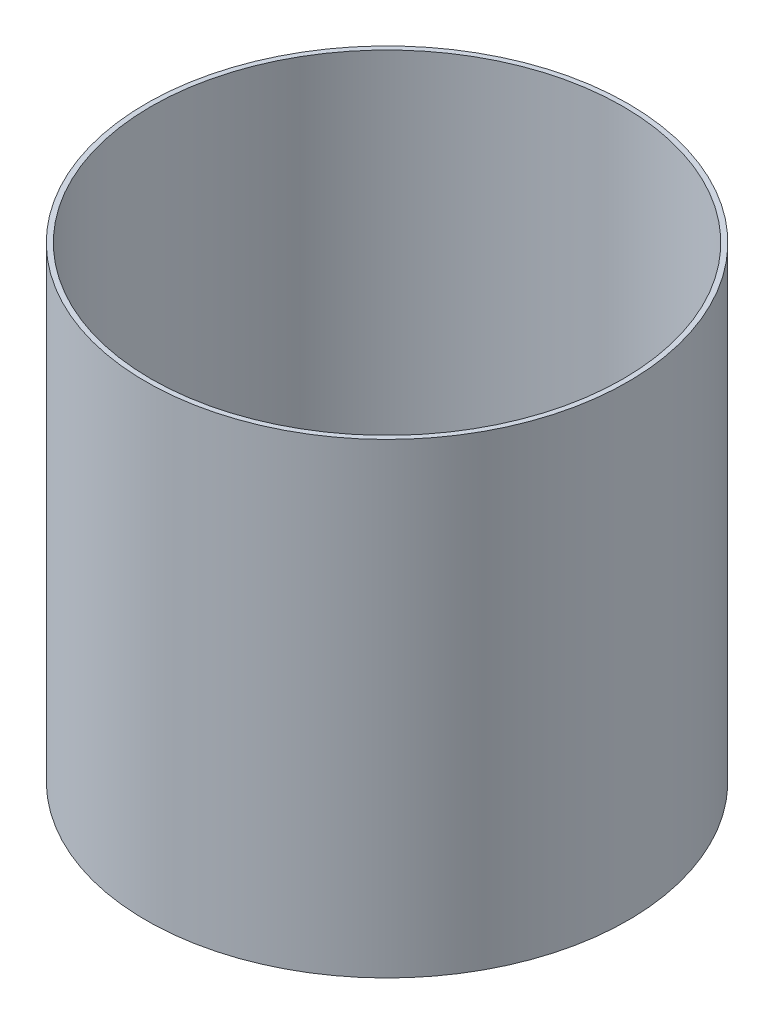
ISO-10303-21;
HEADER;
FILE_DESCRIPTION(('STEP AP214'),'2;1');
FILE_NAME('part.step','',(''),(''),'','','');
FILE_SCHEMA(('AUTOMOTIVE_DESIGN { 1 0 10303 214 1 1 1 1 }'));
ENDSEC;
DATA;
#1=APPLICATION_CONTEXT('core data for automotive mechanical design processes');
#2=APPLICATION_PROTOCOL_DEFINITION('international standard','automotive_design',2000,#1);
#3=PRODUCT_CONTEXT('',#1,'mechanical');
#4=PRODUCT('Part','Part','',(#3));
#5=PRODUCT_RELATED_PRODUCT_CATEGORY('part','',(#4));
#6=PRODUCT_DEFINITION_FORMATION('','',#4);
#7=PRODUCT_DEFINITION_CONTEXT('part definition',#1,'design');
#8=PRODUCT_DEFINITION('design','',#6,#7);
#9=PRODUCT_DEFINITION_SHAPE('','',#8);
#10=(LENGTH_UNIT() NAMED_UNIT(*) SI_UNIT(.MILLI.,.METRE.));
#11=(NAMED_UNIT(*) PLANE_ANGLE_UNIT() SI_UNIT($,.RADIAN.));
#12=(NAMED_UNIT(*) SI_UNIT($,.STERADIAN.) SOLID_ANGLE_UNIT());
#13=UNCERTAINTY_MEASURE_WITH_UNIT(LENGTH_MEASURE(1.E-05),#10,'distance_accuracy_value','');
#14=(GEOMETRIC_REPRESENTATION_CONTEXT(3) GLOBAL_UNCERTAINTY_ASSIGNED_CONTEXT((#13)) GLOBAL_UNIT_ASSIGNED_CONTEXT((#10,
#11,#12)) REPRESENTATION_CONTEXT('',''));
#15=CARTESIAN_POINT('',(0.,0.,0.));
#16=DIRECTION('',(0.,0.,1.));
#17=DIRECTION('',(1.,0.,0.));
#18=AXIS2_PLACEMENT_3D('',#15,#16,#17);
#19=CARTESIAN_POINT('',(759.,0.,0.));
#20=DIRECTION('',(0.,-1.,0.));
#21=DIRECTION('',(0.,0.,-1.));
#22=AXIS2_PLACEMENT_3D('',#19,#20,#21);
#23=PLANE('',#22);
#24=CARTESIAN_POINT('',(0.,0.,0.));
#25=DIRECTION('',(0.,-1.,0.));
#26=DIRECTION('',(0.,0.,-1.));
#27=AXIS2_PLACEMENT_3D('',#24,#25,#26);
#28=CIRCLE('',#27,775.);
#29=CARTESIAN_POINT('',(0.,0.,-775.));
#30=VERTEX_POINT('',#29);
#31=EDGE_CURVE('E10',#30,#30,#28,.T.);
#32=ORIENTED_EDGE('',*,*,#31,.T.);
#33=EDGE_LOOP('',(#32));
#34=FACE_BOUND('',#33,.T.);
#35=CARTESIAN_POINT('',(0.,0.,0.));
#36=DIRECTION('',(0.,-1.,0.));
#37=DIRECTION('',(0.,0.,-1.));
#38=AXIS2_PLACEMENT_3D('',#35,#36,#37);
#39=CIRCLE('',#38,759.);
#40=CARTESIAN_POINT('',(0.,0.,-759.));
#41=VERTEX_POINT('',#40);
#42=EDGE_CURVE('E53',#41,#41,#39,.T.);
#43=ORIENTED_EDGE('',*,*,#42,.F.);
#44=EDGE_LOOP('',(#43));
#45=FACE_BOUND('',#44,.T.);
#46=ADVANCED_FACE('F39',(#34,#45),#23,.T.);
#47=CARTESIAN_POINT('',(0.,0.,0.));
#48=DIRECTION('',(0.,-1.,0.));
#49=DIRECTION('',(0.,0.,-1.));
#50=AXIS2_PLACEMENT_3D('',#47,#48,#49);
#51=CYLINDRICAL_SURFACE('',#50,775.);
#52=CARTESIAN_POINT('',(0.,1500.,0.));
#53=DIRECTION('',(0.,-1.,0.));
#54=DIRECTION('',(0.,0.,-1.));
#55=AXIS2_PLACEMENT_3D('',#52,#53,#54);
#56=CIRCLE('',#55,775.);
#57=CARTESIAN_POINT('',(0.,1500.,-775.));
#58=VERTEX_POINT('',#57);
#59=EDGE_CURVE('E45',#58,#58,#56,.T.);
#60=ORIENTED_EDGE('',*,*,#59,.T.);
#61=EDGE_LOOP('',(#60));
#62=FACE_BOUND('',#61,.T.);
#63=ORIENTED_EDGE('',*,*,#31,.F.);
#64=EDGE_LOOP('',(#63));
#65=FACE_BOUND('',#64,.T.);
#66=ADVANCED_FACE('F63',(#62,#65),#51,.T.);
#67=CARTESIAN_POINT('',(775.,1500.,0.));
#68=DIRECTION('',(0.,1.,0.));
#69=DIRECTION('',(0.,0.,1.));
#70=AXIS2_PLACEMENT_3D('',#67,#68,#69);
#71=PLANE('',#70);
#72=CARTESIAN_POINT('',(0.,1500.,0.));
#73=DIRECTION('',(0.,-1.,0.));
#74=DIRECTION('',(0.,0.,-1.));
#75=AXIS2_PLACEMENT_3D('',#72,#73,#74);
#76=CIRCLE('',#75,759.);
#77=CARTESIAN_POINT('',(0.,1500.,-759.));
#78=VERTEX_POINT('',#77);
#79=EDGE_CURVE('E49',#78,#78,#76,.T.);
#80=ORIENTED_EDGE('',*,*,#79,.T.);
#81=EDGE_LOOP('',(#80));
#82=FACE_BOUND('',#81,.T.);
#83=ORIENTED_EDGE('',*,*,#59,.F.);
#84=EDGE_LOOP('',(#83));
#85=FACE_BOUND('',#84,.T.);
#86=ADVANCED_FACE('F67',(#82,#85),#71,.T.);
#87=CARTESIAN_POINT('',(0.,0.,0.));
#88=DIRECTION('',(0.,-1.,0.));
#89=DIRECTION('',(0.,0.,-1.));
#90=AXIS2_PLACEMENT_3D('',#87,#88,#89);
#91=CYLINDRICAL_SURFACE('',#90,759.);
#92=ORIENTED_EDGE('',*,*,#42,.T.);
#93=EDGE_LOOP('',(#92));
#94=FACE_BOUND('',#93,.T.);
#95=ORIENTED_EDGE('',*,*,#79,.F.);
#96=EDGE_LOOP('',(#95));
#97=FACE_BOUND('',#96,.T.);
#98=ADVANCED_FACE('F59',(#94,#97),#91,.F.);
#99=CLOSED_SHELL('',(#46,#66,#86,#98));
#100=MANIFOLD_SOLID_BREP('B2',#99);
#101=ADVANCED_BREP_SHAPE_REPRESENTATION('',(#18,#100),#14);
#102=SHAPE_DEFINITION_REPRESENTATION(#9,#101);
ENDSEC;
END-ISO-10303-21;
